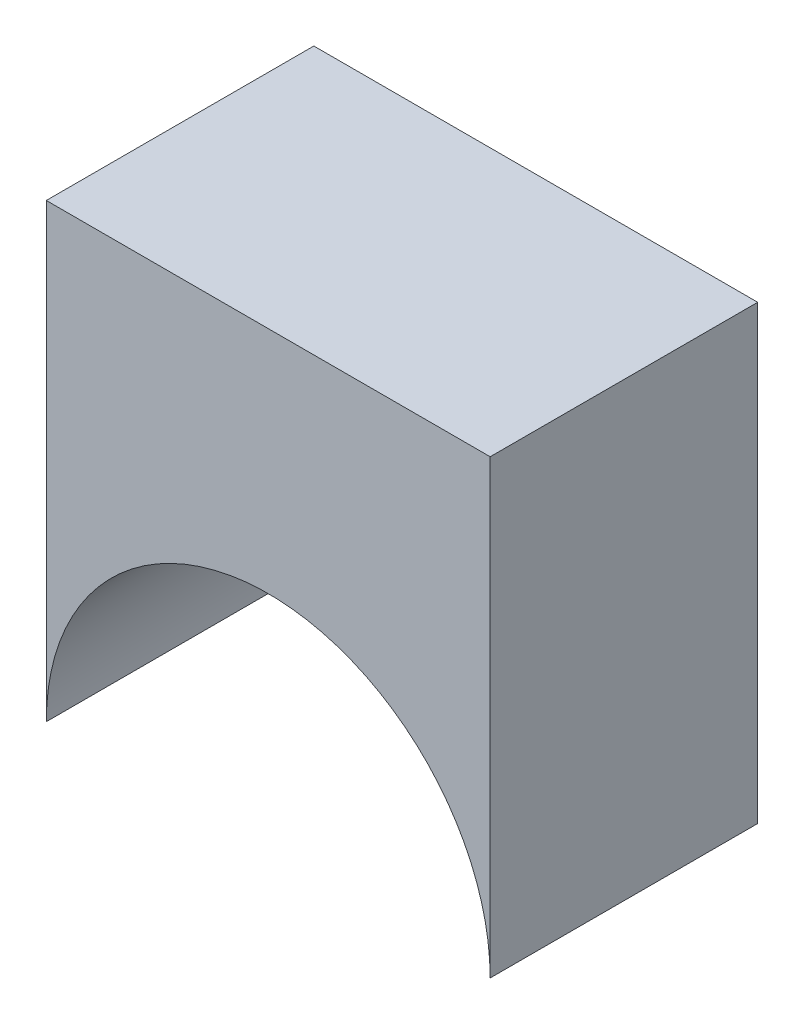
ISO-10303-21;
HEADER;
FILE_DESCRIPTION(('STEP AP214'),'2;1');
FILE_NAME('part.step','',(''),(''),'','','');
FILE_SCHEMA(('AUTOMOTIVE_DESIGN { 1 0 10303 214 1 1 1 1 }'));
ENDSEC;
DATA;
#1=APPLICATION_CONTEXT('core data for automotive mechanical design processes');
#2=APPLICATION_PROTOCOL_DEFINITION('international standard','automotive_design',2000,#1);
#3=PRODUCT_CONTEXT('',#1,'mechanical');
#4=PRODUCT('Part','Part','',(#3));
#5=PRODUCT_RELATED_PRODUCT_CATEGORY('part','',(#4));
#6=PRODUCT_DEFINITION_FORMATION('','',#4);
#7=PRODUCT_DEFINITION_CONTEXT('part definition',#1,'design');
#8=PRODUCT_DEFINITION('design','',#6,#7);
#9=PRODUCT_DEFINITION_SHAPE('','',#8);
#10=(LENGTH_UNIT() NAMED_UNIT(*) SI_UNIT(.MILLI.,.METRE.));
#11=(NAMED_UNIT(*) PLANE_ANGLE_UNIT() SI_UNIT($,.RADIAN.));
#12=(NAMED_UNIT(*) SI_UNIT($,.STERADIAN.) SOLID_ANGLE_UNIT());
#13=UNCERTAINTY_MEASURE_WITH_UNIT(LENGTH_MEASURE(1.E-05),#10,'distance_accuracy_value','');
#14=(GEOMETRIC_REPRESENTATION_CONTEXT(3) GLOBAL_UNCERTAINTY_ASSIGNED_CONTEXT((#13)) GLOBAL_UNIT_ASSIGNED_CONTEXT((#10,
#11,#12)) REPRESENTATION_CONTEXT('',''));
#15=CARTESIAN_POINT('',(0.,0.,0.));
#16=DIRECTION('',(0.,0.,1.));
#17=DIRECTION('',(1.,0.,0.));
#18=AXIS2_PLACEMENT_3D('',#15,#16,#17);
#19=CARTESIAN_POINT('',(18.5,19.13,-11.15));
#20=DIRECTION('',(-1.,0.,0.));
#21=DIRECTION('',(0.,0.,1.));
#22=AXIS2_PLACEMENT_3D('',#19,#20,#21);
#23=PLANE('',#22);
#24=DIRECTION('',(0.,-1.,0.));
#25=VECTOR('',#24,1.);
#26=CARTESIAN_POINT('',(18.5,19.13,11.15));
#27=LINE('',#26,#25);
#28=CARTESIAN_POINT('',(18.5,19.13,11.15));
#29=VERTEX_POINT('',#28);
#30=CARTESIAN_POINT('',(18.5,-18.5,11.15));
#31=VERTEX_POINT('',#30);
#32=EDGE_CURVE('E99',#29,#31,#27,.T.);
#33=ORIENTED_EDGE('',*,*,#32,.T.);
#34=DIRECTION('',(0.,0.,1.));
#35=VECTOR('',#34,1.);
#36=CARTESIAN_POINT('',(18.5,-18.5,-11.15));
#37=LINE('',#36,#35);
#38=CARTESIAN_POINT('',(18.5,-18.5,-11.15));
#39=VERTEX_POINT('',#38);
#40=EDGE_CURVE('E103',#39,#31,#37,.T.);
#41=ORIENTED_EDGE('',*,*,#40,.F.);
#42=DIRECTION('',(0.,-1.,0.));
#43=VECTOR('',#42,1.);
#44=CARTESIAN_POINT('',(18.5,19.13,-11.15));
#45=LINE('',#44,#43);
#46=CARTESIAN_POINT('',(18.5,19.13,-11.15));
#47=VERTEX_POINT('',#46);
#48=EDGE_CURVE('E12',#47,#39,#45,.T.);
#49=ORIENTED_EDGE('',*,*,#48,.F.);
#50=DIRECTION('',(0.,0.,-1.));
#51=VECTOR('',#50,1.);
#52=CARTESIAN_POINT('',(18.5,19.13,-11.15));
#53=LINE('',#52,#51);
#54=EDGE_CURVE('E104',#29,#47,#53,.T.);
#55=ORIENTED_EDGE('',*,*,#54,.F.);
#56=EDGE_LOOP('',(#33,#41,#49,#55));
#57=FACE_BOUND('',#56,.T.);
#58=ADVANCED_FACE('F59',(#57),#23,.F.);
#59=CARTESIAN_POINT('',(-18.5,19.13,-11.15));
#60=DIRECTION('',(0.,0.,1.));
#61=DIRECTION('',(1.,0.,0.));
#62=AXIS2_PLACEMENT_3D('',#59,#60,#61);
#63=PLANE('',#62);
#64=ORIENTED_EDGE('',*,*,#48,.T.);
#65=CARTESIAN_POINT('',(0.,-18.5,-11.15));
#66=DIRECTION('',(0.,0.,1.));
#67=DIRECTION('',(1.,0.,0.));
#68=AXIS2_PLACEMENT_3D('',#65,#66,#67);
#69=CIRCLE('',#68,18.5);
#70=CARTESIAN_POINT('',(-18.5,-18.5,-11.15));
#71=VERTEX_POINT('',#70);
#72=EDGE_CURVE('E116',#71,#39,#69,.F.);
#73=ORIENTED_EDGE('',*,*,#72,.F.);
#74=DIRECTION('',(0.,-1.,0.));
#75=VECTOR('',#74,1.);
#76=CARTESIAN_POINT('',(-18.5,19.13,-11.15));
#77=LINE('',#76,#75);
#78=CARTESIAN_POINT('',(-18.5,19.13,-11.15));
#79=VERTEX_POINT('',#78);
#80=EDGE_CURVE('E67',#79,#71,#77,.T.);
#81=ORIENTED_EDGE('',*,*,#80,.F.);
#82=DIRECTION('',(-1.,0.,0.));
#83=VECTOR('',#82,1.);
#84=CARTESIAN_POINT('',(-18.5,19.13,-11.15));
#85=LINE('',#84,#83);
#86=EDGE_CURVE('E131',#47,#79,#85,.T.);
#87=ORIENTED_EDGE('',*,*,#86,.F.);
#88=EDGE_LOOP('',(#64,#73,#81,#87));
#89=FACE_BOUND('',#88,.T.);
#90=ADVANCED_FACE('F144',(#89),#63,.F.);
#91=CARTESIAN_POINT('',(-18.5,19.13,-11.15));
#92=DIRECTION('',(1.,0.,0.));
#93=DIRECTION('',(0.,0.,-1.));
#94=AXIS2_PLACEMENT_3D('',#91,#92,#93);
#95=PLANE('',#94);
#96=ORIENTED_EDGE('',*,*,#80,.T.);
#97=DIRECTION('',(0.,0.,1.));
#98=VECTOR('',#97,1.);
#99=CARTESIAN_POINT('',(-18.5,-18.5,-11.15));
#100=LINE('',#99,#98);
#101=CARTESIAN_POINT('',(-18.5,-18.5,11.15));
#102=VERTEX_POINT('',#101);
#103=EDGE_CURVE('E125',#71,#102,#100,.T.);
#104=ORIENTED_EDGE('',*,*,#103,.T.);
#105=DIRECTION('',(0.,-1.,0.));
#106=VECTOR('',#105,1.);
#107=CARTESIAN_POINT('',(-18.5,19.13,11.15));
#108=LINE('',#107,#106);
#109=CARTESIAN_POINT('',(-18.5,19.13,11.15));
#110=VERTEX_POINT('',#109);
#111=EDGE_CURVE('E107',#110,#102,#108,.T.);
#112=ORIENTED_EDGE('',*,*,#111,.F.);
#113=DIRECTION('',(0.,0.,1.));
#114=VECTOR('',#113,1.);
#115=CARTESIAN_POINT('',(-18.5,19.13,-11.15));
#116=LINE('',#115,#114);
#117=EDGE_CURVE('E79',#79,#110,#116,.T.);
#118=ORIENTED_EDGE('',*,*,#117,.F.);
#119=EDGE_LOOP('',(#96,#104,#112,#118));
#120=FACE_BOUND('',#119,.T.);
#121=ADVANCED_FACE('F142',(#120),#95,.F.);
#122=CARTESIAN_POINT('',(-18.5,19.13,11.15));
#123=DIRECTION('',(0.,0.,-1.));
#124=DIRECTION('',(-1.,0.,0.));
#125=AXIS2_PLACEMENT_3D('',#122,#123,#124);
#126=PLANE('',#125);
#127=ORIENTED_EDGE('',*,*,#111,.T.);
#128=CARTESIAN_POINT('',(0.,-18.5,11.15));
#129=DIRECTION('',(0.,0.,1.));
#130=DIRECTION('',(1.,0.,0.));
#131=AXIS2_PLACEMENT_3D('',#128,#129,#130);
#132=CIRCLE('',#131,18.5);
#133=EDGE_CURVE('E110',#102,#31,#132,.F.);
#134=ORIENTED_EDGE('',*,*,#133,.T.);
#135=ORIENTED_EDGE('',*,*,#32,.F.);
#136=DIRECTION('',(1.,0.,0.));
#137=VECTOR('',#136,1.);
#138=CARTESIAN_POINT('',(-18.5,19.13,11.15));
#139=LINE('',#138,#137);
#140=EDGE_CURVE('E74',#110,#29,#139,.T.);
#141=ORIENTED_EDGE('',*,*,#140,.F.);
#142=EDGE_LOOP('',(#127,#134,#135,#141));
#143=FACE_BOUND('',#142,.T.);
#144=ADVANCED_FACE('F111',(#143),#126,.F.);
#145=CARTESIAN_POINT('',(0.,19.13,0.));
#146=DIRECTION('',(0.,1.,0.));
#147=DIRECTION('',(0.,0.,1.));
#148=AXIS2_PLACEMENT_3D('',#145,#146,#147);
#149=PLANE('',#148);
#150=ORIENTED_EDGE('',*,*,#54,.T.);
#151=ORIENTED_EDGE('',*,*,#86,.T.);
#152=ORIENTED_EDGE('',*,*,#117,.T.);
#153=ORIENTED_EDGE('',*,*,#140,.T.);
#154=EDGE_LOOP('',(#150,#151,#152,#153));
#155=FACE_BOUND('',#154,.T.);
#156=ADVANCED_FACE('F145',(#155),#149,.T.);
#157=CARTESIAN_POINT('',(0.,-18.5,-11.15));
#158=DIRECTION('',(0.,0.,1.));
#159=DIRECTION('',(1.,0.,0.));
#160=AXIS2_PLACEMENT_3D('',#157,#158,#159);
#161=CYLINDRICAL_SURFACE('',#160,18.5);
#162=ORIENTED_EDGE('',*,*,#133,.F.);
#163=ORIENTED_EDGE('',*,*,#103,.F.);
#164=ORIENTED_EDGE('',*,*,#72,.T.);
#165=ORIENTED_EDGE('',*,*,#40,.T.);
#166=EDGE_LOOP('',(#162,#163,#164,#165));
#167=FACE_BOUND('',#166,.T.);
#168=ADVANCED_FACE('F119',(#167),#161,.F.);
#169=CLOSED_SHELL('',(#58,#90,#121,#144,#156,#168));
#170=MANIFOLD_SOLID_BREP('B2',#169);
#171=ADVANCED_BREP_SHAPE_REPRESENTATION('',(#18,#170),#14);
#172=SHAPE_DEFINITION_REPRESENTATION(#9,#171);
ENDSEC;
END-ISO-10303-21;
